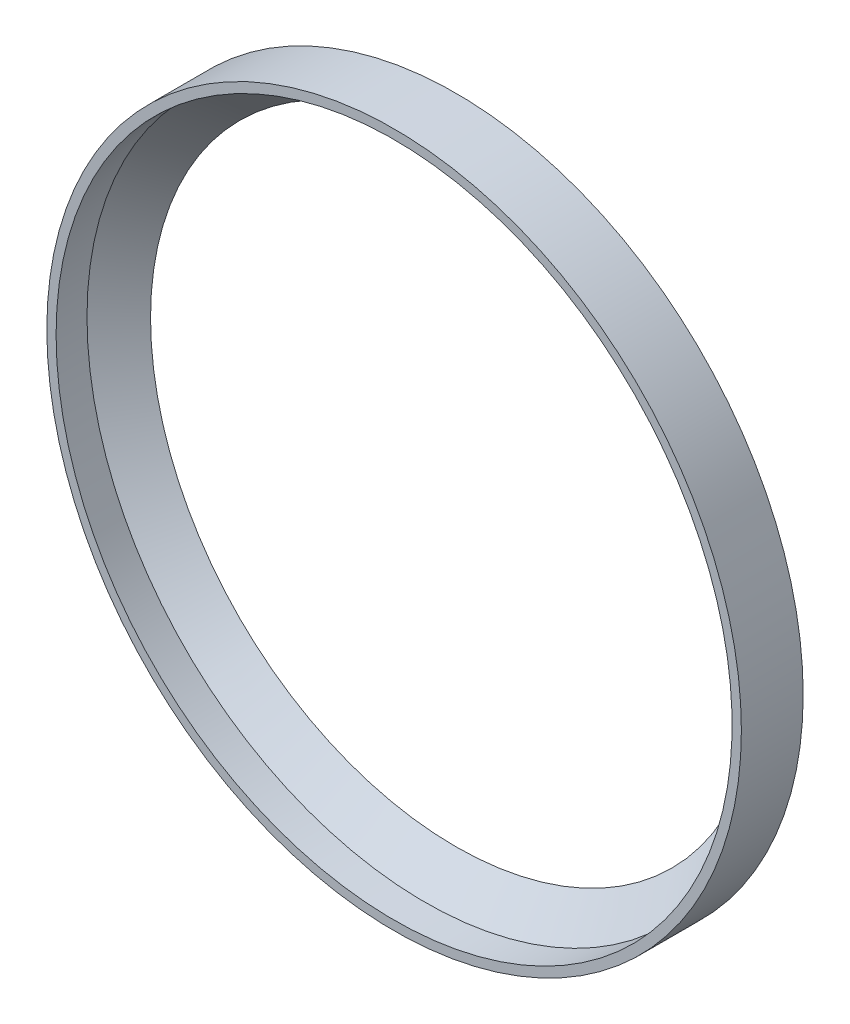
ISO-10303-21;
HEADER;
FILE_DESCRIPTION(('STEP AP214'),'2;1');
FILE_NAME('part.step','',(''),(''),'','','');
FILE_SCHEMA(('AUTOMOTIVE_DESIGN { 1 0 10303 214 1 1 1 1 }'));
ENDSEC;
DATA;
#1=APPLICATION_CONTEXT('core data for automotive mechanical design processes');
#2=APPLICATION_PROTOCOL_DEFINITION('international standard','automotive_design',2000,#1);
#3=PRODUCT_CONTEXT('',#1,'mechanical');
#4=PRODUCT('Part','Part','',(#3));
#5=PRODUCT_RELATED_PRODUCT_CATEGORY('part','',(#4));
#6=PRODUCT_DEFINITION_FORMATION('','',#4);
#7=PRODUCT_DEFINITION_CONTEXT('part definition',#1,'design');
#8=PRODUCT_DEFINITION('design','',#6,#7);
#9=PRODUCT_DEFINITION_SHAPE('','',#8);
#10=(LENGTH_UNIT() NAMED_UNIT(*) SI_UNIT(.MILLI.,.METRE.));
#11=(NAMED_UNIT(*) PLANE_ANGLE_UNIT() SI_UNIT($,.RADIAN.));
#12=(NAMED_UNIT(*) SI_UNIT($,.STERADIAN.) SOLID_ANGLE_UNIT());
#13=UNCERTAINTY_MEASURE_WITH_UNIT(LENGTH_MEASURE(1.E-05),#10,'distance_accuracy_value','');
#14=(GEOMETRIC_REPRESENTATION_CONTEXT(3) GLOBAL_UNCERTAINTY_ASSIGNED_CONTEXT((#13)) GLOBAL_UNIT_ASSIGNED_CONTEXT((#10,
#11,#12)) REPRESENTATION_CONTEXT('',''));
#15=CARTESIAN_POINT('',(0.,0.,0.));
#16=DIRECTION('',(0.,0.,1.));
#17=DIRECTION('',(1.,0.,0.));
#18=AXIS2_PLACEMENT_3D('',#15,#16,#17);
#19=CARTESIAN_POINT('',(142.71625,0.,-12.7));
#20=DIRECTION('',(0.,0.,1.));
#21=DIRECTION('',(1.,0.,0.));
#22=AXIS2_PLACEMENT_3D('',#19,#20,#21);
#23=PLANE('',#22);
#24=CARTESIAN_POINT('',(0.,0.,-12.7));
#25=DIRECTION('',(0.,0.,-1.));
#26=DIRECTION('',(-1.,0.,0.));
#27=AXIS2_PLACEMENT_3D('',#24,#25,#26);
#28=CIRCLE('',#27,125.48851924225);
#29=CARTESIAN_POINT('',(-125.48851924225,0.,-12.7));
#30=VERTEX_POINT('',#29);
#31=EDGE_CURVE('E54',#30,#30,#28,.T.);
#32=ORIENTED_EDGE('',*,*,#31,.F.);
#33=EDGE_LOOP('',(#32));
#34=FACE_BOUND('',#33,.T.);
#35=CARTESIAN_POINT('',(0.,0.,-12.7));
#36=DIRECTION('',(0.,0.,-1.));
#37=DIRECTION('',(-1.,0.,0.));
#38=AXIS2_PLACEMENT_3D('',#35,#36,#37);
#39=CIRCLE('',#38,142.71625);
#40=CARTESIAN_POINT('',(-142.71625,0.,-12.7));
#41=VERTEX_POINT('',#40);
#42=EDGE_CURVE('E10',#41,#41,#39,.T.);
#43=ORIENTED_EDGE('',*,*,#42,.T.);
#44=EDGE_LOOP('',(#43));
#45=FACE_BOUND('',#44,.T.);
#46=ADVANCED_FACE('F35',(#34,#45),#23,.F.);
#47=CARTESIAN_POINT('',(0.,0.,-86.6875863562479));
#48=DIRECTION('',(0.,0.,-1.));
#49=DIRECTION('',(-1.,0.,0.));
#50=AXIS2_PLACEMENT_3D('',#47,#48,#49);
#51=CYLINDRICAL_SURFACE('',#50,142.71625);
#52=ORIENTED_EDGE('',*,*,#42,.F.);
#53=EDGE_LOOP('',(#52));
#54=FACE_BOUND('',#53,.T.);
#55=CARTESIAN_POINT('',(0.,0.,12.7));
#56=DIRECTION('',(0.,0.,-1.));
#57=DIRECTION('',(-1.,0.,0.));
#58=AXIS2_PLACEMENT_3D('',#55,#56,#57);
#59=CIRCLE('',#58,142.71625);
#60=CARTESIAN_POINT('',(-142.71625,0.,12.7));
#61=VERTEX_POINT('',#60);
#62=EDGE_CURVE('E41',#61,#61,#59,.T.);
#63=ORIENTED_EDGE('',*,*,#62,.T.);
#64=EDGE_LOOP('',(#63));
#65=FACE_BOUND('',#64,.T.);
#66=ADVANCED_FACE('F61',(#54,#65),#51,.T.);
#67=CARTESIAN_POINT('',(142.71625,0.,12.7));
#68=DIRECTION('',(0.,0.,-1.));
#69=DIRECTION('',(-1.,0.,0.));
#70=AXIS2_PLACEMENT_3D('',#67,#68,#69);
#71=PLANE('',#70);
#72=ORIENTED_EDGE('',*,*,#62,.F.);
#73=EDGE_LOOP('',(#72));
#74=FACE_BOUND('',#73,.T.);
#75=CARTESIAN_POINT('',(0.,0.,12.7));
#76=DIRECTION('',(0.,0.,-1.));
#77=DIRECTION('',(-1.,0.,0.));
#78=AXIS2_PLACEMENT_3D('',#75,#76,#77);
#79=CIRCLE('',#78,138.90625);
#80=CARTESIAN_POINT('',(-138.90625,0.,12.7));
#81=VERTEX_POINT('',#80);
#82=EDGE_CURVE('E45',#81,#81,#79,.T.);
#83=ORIENTED_EDGE('',*,*,#82,.T.);
#84=EDGE_LOOP('',(#83));
#85=FACE_BOUND('',#84,.T.);
#86=ADVANCED_FACE('F65',(#74,#85),#71,.F.);
#87=CARTESIAN_POINT('',(0.,0.,-86.6875863562479));
#88=DIRECTION('',(0.,0.,-1.));
#89=DIRECTION('',(-1.,0.,0.));
#90=AXIS2_PLACEMENT_3D('',#87,#88,#89);
#91=CYLINDRICAL_SURFACE('',#90,138.90625);
#92=ORIENTED_EDGE('',*,*,#82,.F.);
#93=EDGE_LOOP('',(#92));
#94=FACE_BOUND('',#93,.T.);
#95=CARTESIAN_POINT('',(0.,0.,0.));
#96=DIRECTION('',(0.,0.,-1.));
#97=DIRECTION('',(-1.,0.,0.));
#98=AXIS2_PLACEMENT_3D('',#95,#96,#97);
#99=CIRCLE('',#98,138.90625);
#100=CARTESIAN_POINT('',(-138.90625,0.,0.));
#101=VERTEX_POINT('',#100);
#102=EDGE_CURVE('E49',#101,#101,#99,.T.);
#103=ORIENTED_EDGE('',*,*,#102,.T.);
#104=EDGE_LOOP('',(#103));
#105=FACE_BOUND('',#104,.T.);
#106=ADVANCED_FACE('F70',(#94,#105),#91,.F.);
#107=CARTESIAN_POINT('',(0.,0.,-12.7));
#108=DIRECTION('',(0.,0.,1.));
#109=DIRECTION('',(1.,0.,0.));
#110=AXIS2_PLACEMENT_3D('',#107,#108,#109);
#111=CONICAL_SURFACE('',#110,125.48851924225,0.812871843003247);
#112=ORIENTED_EDGE('',*,*,#102,.F.);
#113=EDGE_LOOP('',(#112));
#114=FACE_BOUND('',#113,.T.);
#115=ORIENTED_EDGE('',*,*,#31,.T.);
#116=EDGE_LOOP('',(#115));
#117=FACE_BOUND('',#116,.T.);
#118=ADVANCED_FACE('F58',(#114,#117),#111,.F.);
#119=CLOSED_SHELL('',(#46,#66,#86,#106,#118));
#120=MANIFOLD_SOLID_BREP('B2',#119);
#121=ADVANCED_BREP_SHAPE_REPRESENTATION('',(#18,#120),#14);
#122=SHAPE_DEFINITION_REPRESENTATION(#9,#121);
ENDSEC;
END-ISO-10303-21;
